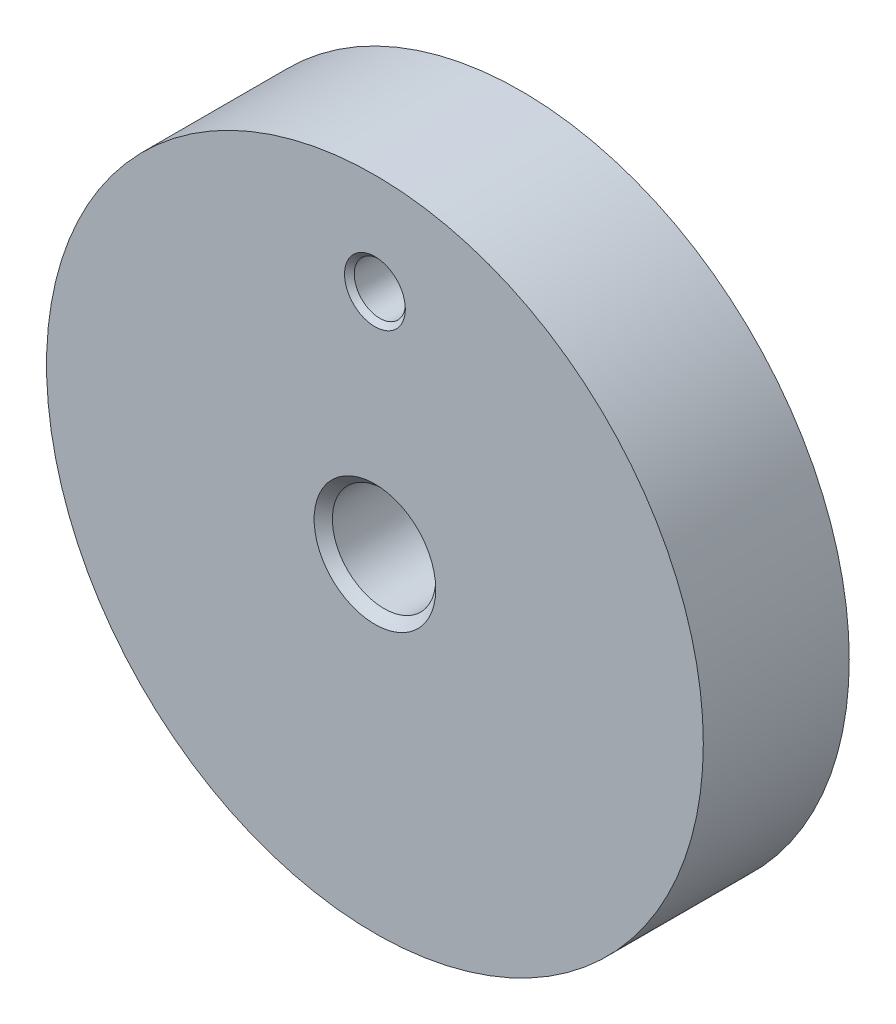
ISO-10303-21;
HEADER;
FILE_DESCRIPTION(('STEP AP214'),'2;1');
FILE_NAME('part.step','',(''),(''),'','','');
FILE_SCHEMA(('AUTOMOTIVE_DESIGN { 1 0 10303 214 1 1 1 1 }'));
ENDSEC;
DATA;
#1=APPLICATION_CONTEXT('core data for automotive mechanical design processes');
#2=APPLICATION_PROTOCOL_DEFINITION('international standard','automotive_design',2000,#1);
#3=PRODUCT_CONTEXT('',#1,'mechanical');
#4=PRODUCT('Part','Part','',(#3));
#5=PRODUCT_RELATED_PRODUCT_CATEGORY('part','',(#4));
#6=PRODUCT_DEFINITION_FORMATION('','',#4);
#7=PRODUCT_DEFINITION_CONTEXT('part definition',#1,'design');
#8=PRODUCT_DEFINITION('design','',#6,#7);
#9=PRODUCT_DEFINITION_SHAPE('','',#8);
#10=(LENGTH_UNIT() NAMED_UNIT(*) SI_UNIT(.MILLI.,.METRE.));
#11=(NAMED_UNIT(*) PLANE_ANGLE_UNIT() SI_UNIT($,.RADIAN.));
#12=(NAMED_UNIT(*) SI_UNIT($,.STERADIAN.) SOLID_ANGLE_UNIT());
#13=UNCERTAINTY_MEASURE_WITH_UNIT(LENGTH_MEASURE(1.E-05),#10,'distance_accuracy_value','');
#14=(GEOMETRIC_REPRESENTATION_CONTEXT(3) GLOBAL_UNCERTAINTY_ASSIGNED_CONTEXT((#13)) GLOBAL_UNIT_ASSIGNED_CONTEXT((#10,
#11,#12)) REPRESENTATION_CONTEXT('',''));
#15=CARTESIAN_POINT('',(0.,0.,0.));
#16=DIRECTION('',(0.,0.,1.));
#17=DIRECTION('',(1.,0.,0.));
#18=AXIS2_PLACEMENT_3D('',#15,#16,#17);
#19=CARTESIAN_POINT('',(0.,0.,12.));
#20=DIRECTION('',(0.,0.,-1.));
#21=DIRECTION('',(-1.,0.,0.));
#22=AXIS2_PLACEMENT_3D('',#19,#20,#21);
#23=CYLINDRICAL_SURFACE('',#22,27.);
#24=CARTESIAN_POINT('',(0.,0.,12.));
#25=DIRECTION('',(0.,0.,1.));
#26=DIRECTION('',(1.,0.,0.));
#27=AXIS2_PLACEMENT_3D('',#24,#25,#26);
#28=CIRCLE('',#27,27.);
#29=CARTESIAN_POINT('',(27.,0.,12.));
#30=VERTEX_POINT('',#29);
#31=EDGE_CURVE('E11',#30,#30,#28,.T.);
#32=ORIENTED_EDGE('',*,*,#31,.F.);
#33=EDGE_LOOP('',(#32));
#34=FACE_BOUND('',#33,.T.);
#35=CARTESIAN_POINT('',(0.,0.,0.));
#36=DIRECTION('',(0.,0.,1.));
#37=DIRECTION('',(1.,0.,0.));
#38=AXIS2_PLACEMENT_3D('',#35,#36,#37);
#39=CIRCLE('',#38,27.);
#40=CARTESIAN_POINT('',(27.,0.,0.));
#41=VERTEX_POINT('',#40);
#42=EDGE_CURVE('E66',#41,#41,#39,.T.);
#43=ORIENTED_EDGE('',*,*,#42,.T.);
#44=EDGE_LOOP('',(#43));
#45=FACE_BOUND('',#44,.T.);
#46=ADVANCED_FACE('F62',(#34,#45),#23,.T.);
#47=CARTESIAN_POINT('',(0.,0.,12.));
#48=DIRECTION('',(0.,0.,1.));
#49=DIRECTION('',(1.,0.,0.));
#50=AXIS2_PLACEMENT_3D('',#47,#48,#49);
#51=PLANE('',#50);
#52=CARTESIAN_POINT('',(0.,18.6969896300883,12.));
#53=DIRECTION('',(0.,0.,1.));
#54=DIRECTION('',(1.,0.,0.));
#55=AXIS2_PLACEMENT_3D('',#52,#53,#54);
#56=CIRCLE('',#55,2.5);
#57=CARTESIAN_POINT('',(2.5,18.6969896300883,12.));
#58=VERTEX_POINT('',#57);
#59=EDGE_CURVE('E103',#58,#58,#56,.T.);
#60=ORIENTED_EDGE('',*,*,#59,.F.);
#61=EDGE_LOOP('',(#60));
#62=FACE_BOUND('',#61,.T.);
#63=CARTESIAN_POINT('',(0.,0.,12.));
#64=DIRECTION('',(0.,0.,1.));
#65=DIRECTION('',(1.,0.,0.));
#66=AXIS2_PLACEMENT_3D('',#63,#64,#65);
#67=CIRCLE('',#66,5.);
#68=CARTESIAN_POINT('',(5.,0.,12.));
#69=VERTEX_POINT('',#68);
#70=EDGE_CURVE('E84',#69,#69,#67,.T.);
#71=ORIENTED_EDGE('',*,*,#70,.F.);
#72=EDGE_LOOP('',(#71));
#73=FACE_BOUND('',#72,.T.);
#74=ORIENTED_EDGE('',*,*,#31,.T.);
#75=EDGE_LOOP('',(#74));
#76=FACE_BOUND('',#75,.T.);
#77=ADVANCED_FACE('F132',(#62,#73,#76),#51,.T.);
#78=CARTESIAN_POINT('',(0.,0.,0.));
#79=DIRECTION('',(0.,0.,1.));
#80=DIRECTION('',(1.,0.,0.));
#81=AXIS2_PLACEMENT_3D('',#78,#79,#80);
#82=PLANE('',#81);
#83=CARTESIAN_POINT('',(0.,18.6969896300883,0.));
#84=DIRECTION('',(0.,0.,1.));
#85=DIRECTION('',(1.,0.,0.));
#86=AXIS2_PLACEMENT_3D('',#83,#84,#85);
#87=CIRCLE('',#86,2.5);
#88=CARTESIAN_POINT('',(2.5,18.6969896300883,0.));
#89=VERTEX_POINT('',#88);
#90=EDGE_CURVE('E102',#89,#89,#87,.T.);
#91=ORIENTED_EDGE('',*,*,#90,.T.);
#92=EDGE_LOOP('',(#91));
#93=FACE_BOUND('',#92,.T.);
#94=CARTESIAN_POINT('',(0.,0.,0.));
#95=DIRECTION('',(0.,0.,1.));
#96=DIRECTION('',(1.,0.,0.));
#97=AXIS2_PLACEMENT_3D('',#94,#95,#96);
#98=CIRCLE('',#97,5.);
#99=CARTESIAN_POINT('',(5.,0.,0.));
#100=VERTEX_POINT('',#99);
#101=EDGE_CURVE('E88',#100,#100,#98,.T.);
#102=ORIENTED_EDGE('',*,*,#101,.T.);
#103=EDGE_LOOP('',(#102));
#104=FACE_BOUND('',#103,.T.);
#105=ORIENTED_EDGE('',*,*,#42,.F.);
#106=EDGE_LOOP('',(#105));
#107=FACE_BOUND('',#106,.T.);
#108=ADVANCED_FACE('F111',(#93,#104,#107),#82,.F.);
#109=CARTESIAN_POINT('',(0.,0.,0.750000000000004));
#110=DIRECTION('',(0.,0.,-1.));
#111=DIRECTION('',(-1.,0.,0.));
#112=AXIS2_PLACEMENT_3D('',#109,#110,#111);
#113=CONICAL_SURFACE('',#112,4.25,0.785398163397445);
#114=ORIENTED_EDGE('',*,*,#101,.F.);
#115=EDGE_LOOP('',(#114));
#116=FACE_BOUND('',#115,.T.);
#117=CARTESIAN_POINT('',(0.,0.,0.750000000000004));
#118=DIRECTION('',(0.,0.,1.));
#119=DIRECTION('',(1.,0.,0.));
#120=AXIS2_PLACEMENT_3D('',#117,#118,#119);
#121=CIRCLE('',#120,4.25);
#122=CARTESIAN_POINT('',(4.25,0.,0.750000000000004));
#123=VERTEX_POINT('',#122);
#124=EDGE_CURVE('E77',#123,#123,#121,.T.);
#125=ORIENTED_EDGE('',*,*,#124,.T.);
#126=EDGE_LOOP('',(#125));
#127=FACE_BOUND('',#126,.T.);
#128=ADVANCED_FACE('F150',(#116,#127),#113,.F.);
#129=CARTESIAN_POINT('',(0.,0.,12.));
#130=DIRECTION('',(0.,0.,1.));
#131=DIRECTION('',(1.,0.,0.));
#132=AXIS2_PLACEMENT_3D('',#129,#130,#131);
#133=CYLINDRICAL_SURFACE('',#132,4.25);
#134=ORIENTED_EDGE('',*,*,#124,.F.);
#135=EDGE_LOOP('',(#134));
#136=FACE_BOUND('',#135,.T.);
#137=CARTESIAN_POINT('',(0.,0.,11.25));
#138=DIRECTION('',(0.,0.,1.));
#139=DIRECTION('',(1.,0.,0.));
#140=AXIS2_PLACEMENT_3D('',#137,#138,#139);
#141=CIRCLE('',#140,4.25);
#142=CARTESIAN_POINT('',(4.25,0.,11.25));
#143=VERTEX_POINT('',#142);
#144=EDGE_CURVE('E81',#143,#143,#141,.T.);
#145=ORIENTED_EDGE('',*,*,#144,.T.);
#146=EDGE_LOOP('',(#145));
#147=FACE_BOUND('',#146,.T.);
#148=ADVANCED_FACE('F140',(#136,#147),#133,.F.);
#149=CARTESIAN_POINT('',(0.,0.,12.));
#150=DIRECTION('',(0.,0.,1.));
#151=DIRECTION('',(1.,0.,0.));
#152=AXIS2_PLACEMENT_3D('',#149,#150,#151);
#153=CONICAL_SURFACE('',#152,5.,0.78539816339745);
#154=ORIENTED_EDGE('',*,*,#144,.F.);
#155=EDGE_LOOP('',(#154));
#156=FACE_BOUND('',#155,.T.);
#157=ORIENTED_EDGE('',*,*,#70,.T.);
#158=EDGE_LOOP('',(#157));
#159=FACE_BOUND('',#158,.T.);
#160=ADVANCED_FACE('F117',(#156,#159),#153,.F.);
#161=CARTESIAN_POINT('',(0.,18.6969896300883,0.400000000000003));
#162=DIRECTION('',(0.,0.,-1.));
#163=DIRECTION('',(-1.,0.,0.));
#164=AXIS2_PLACEMENT_3D('',#161,#162,#163);
#165=CONICAL_SURFACE('',#164,2.1,0.785398163397445);
#166=ORIENTED_EDGE('',*,*,#90,.F.);
#167=EDGE_LOOP('',(#166));
#168=FACE_BOUND('',#167,.T.);
#169=CARTESIAN_POINT('',(0.,18.6969896300883,0.400000000000003));
#170=DIRECTION('',(0.,0.,1.));
#171=DIRECTION('',(1.,0.,0.));
#172=AXIS2_PLACEMENT_3D('',#169,#170,#171);
#173=CIRCLE('',#172,2.1);
#174=CARTESIAN_POINT('',(2.1,18.6969896300883,0.400000000000003));
#175=VERTEX_POINT('',#174);
#176=EDGE_CURVE('E94',#175,#175,#173,.T.);
#177=ORIENTED_EDGE('',*,*,#176,.T.);
#178=EDGE_LOOP('',(#177));
#179=FACE_BOUND('',#178,.T.);
#180=ADVANCED_FACE('F112',(#168,#179),#165,.F.);
#181=CARTESIAN_POINT('',(0.,18.6969896300883,12.));
#182=DIRECTION('',(0.,0.,1.));
#183=DIRECTION('',(1.,0.,0.));
#184=AXIS2_PLACEMENT_3D('',#181,#182,#183);
#185=CYLINDRICAL_SURFACE('',#184,2.1);
#186=ORIENTED_EDGE('',*,*,#176,.F.);
#187=EDGE_LOOP('',(#186));
#188=FACE_BOUND('',#187,.T.);
#189=CARTESIAN_POINT('',(0.,18.6969896300883,11.6));
#190=DIRECTION('',(0.,0.,1.));
#191=DIRECTION('',(1.,0.,0.));
#192=AXIS2_PLACEMENT_3D('',#189,#190,#191);
#193=CIRCLE('',#192,2.1);
#194=CARTESIAN_POINT('',(2.1,18.6969896300883,11.6));
#195=VERTEX_POINT('',#194);
#196=EDGE_CURVE('E97',#195,#195,#193,.T.);
#197=ORIENTED_EDGE('',*,*,#196,.T.);
#198=EDGE_LOOP('',(#197));
#199=FACE_BOUND('',#198,.T.);
#200=ADVANCED_FACE('F120',(#188,#199),#185,.F.);
#201=CARTESIAN_POINT('',(0.,18.6969896300883,12.));
#202=DIRECTION('',(0.,0.,1.));
#203=DIRECTION('',(1.,0.,0.));
#204=AXIS2_PLACEMENT_3D('',#201,#202,#203);
#205=CONICAL_SURFACE('',#204,2.5,0.785398163397448);
#206=ORIENTED_EDGE('',*,*,#196,.F.);
#207=EDGE_LOOP('',(#206));
#208=FACE_BOUND('',#207,.T.);
#209=ORIENTED_EDGE('',*,*,#59,.T.);
#210=EDGE_LOOP('',(#209));
#211=FACE_BOUND('',#210,.T.);
#212=ADVANCED_FACE('F121',(#208,#211),#205,.F.);
#213=CLOSED_SHELL('',(#46,#77,#108,#128,#148,#160,#180,#200,#212));
#214=MANIFOLD_SOLID_BREP('B2',#213);
#215=ADVANCED_BREP_SHAPE_REPRESENTATION('',(#18,#214),#14);
#216=SHAPE_DEFINITION_REPRESENTATION(#9,#215);
ENDSEC;
END-ISO-10303-21;
